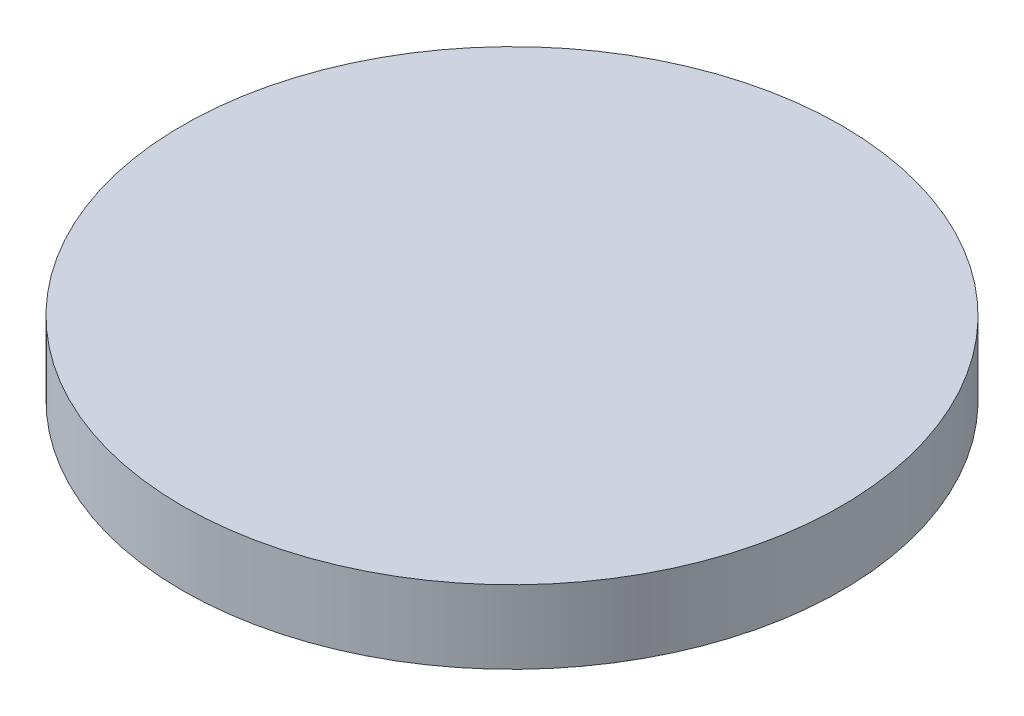
ISO-10303-21;
HEADER;
FILE_DESCRIPTION(('STEP AP214'),'2;1');
FILE_NAME('part.step','',(''),(''),'','','');
FILE_SCHEMA(('AUTOMOTIVE_DESIGN { 1 0 10303 214 1 1 1 1 }'));
ENDSEC;
DATA;
#1=APPLICATION_CONTEXT('core data for automotive mechanical design processes');
#2=APPLICATION_PROTOCOL_DEFINITION('international standard','automotive_design',2000,#1);
#3=PRODUCT_CONTEXT('',#1,'mechanical');
#4=PRODUCT('Part','Part','',(#3));
#5=PRODUCT_RELATED_PRODUCT_CATEGORY('part','',(#4));
#6=PRODUCT_DEFINITION_FORMATION('','',#4);
#7=PRODUCT_DEFINITION_CONTEXT('part definition',#1,'design');
#8=PRODUCT_DEFINITION('design','',#6,#7);
#9=PRODUCT_DEFINITION_SHAPE('','',#8);
#10=(LENGTH_UNIT() NAMED_UNIT(*) SI_UNIT(.MILLI.,.METRE.));
#11=(NAMED_UNIT(*) PLANE_ANGLE_UNIT() SI_UNIT($,.RADIAN.));
#12=(NAMED_UNIT(*) SI_UNIT($,.STERADIAN.) SOLID_ANGLE_UNIT());
#13=UNCERTAINTY_MEASURE_WITH_UNIT(LENGTH_MEASURE(1.E-05),#10,'distance_accuracy_value','');
#14=(GEOMETRIC_REPRESENTATION_CONTEXT(3) GLOBAL_UNCERTAINTY_ASSIGNED_CONTEXT((#13)) GLOBAL_UNIT_ASSIGNED_CONTEXT((#10,
#11,#12)) REPRESENTATION_CONTEXT('',''));
#15=CARTESIAN_POINT('',(0.,0.,0.));
#16=DIRECTION('',(0.,0.,1.));
#17=DIRECTION('',(1.,0.,0.));
#18=AXIS2_PLACEMENT_3D('',#15,#16,#17);
#19=CARTESIAN_POINT('',(0.,4.23333333333333,0.));
#20=DIRECTION('',(0.,-1.,0.));
#21=DIRECTION('',(0.,0.,-1.));
#22=AXIS2_PLACEMENT_3D('',#19,#20,#21);
#23=CYLINDRICAL_SURFACE('',#22,19.05);
#24=CARTESIAN_POINT('',(0.,4.23333333333333,0.));
#25=DIRECTION('',(0.,1.,0.));
#26=DIRECTION('',(0.,0.,1.));
#27=AXIS2_PLACEMENT_3D('',#24,#25,#26);
#28=CIRCLE('',#27,19.05);
#29=CARTESIAN_POINT('',(0.,4.23333333333333,19.05));
#30=VERTEX_POINT('',#29);
#31=EDGE_CURVE('E37',#30,#30,#28,.T.);
#32=ORIENTED_EDGE('',*,*,#31,.F.);
#33=EDGE_LOOP('',(#32));
#34=FACE_BOUND('',#33,.T.);
#35=CARTESIAN_POINT('',(0.,0.,0.));
#36=DIRECTION('',(0.,1.,0.));
#37=DIRECTION('',(0.,0.,1.));
#38=AXIS2_PLACEMENT_3D('',#35,#36,#37);
#39=CIRCLE('',#38,19.05);
#40=CARTESIAN_POINT('',(0.,0.,19.05));
#41=VERTEX_POINT('',#40);
#42=EDGE_CURVE('E41',#41,#41,#39,.T.);
#43=ORIENTED_EDGE('',*,*,#42,.T.);
#44=EDGE_LOOP('',(#43));
#45=FACE_BOUND('',#44,.T.);
#46=ADVANCED_FACE('F31',(#34,#45),#23,.T.);
#47=CARTESIAN_POINT('',(0.,4.23333333333333,0.));
#48=DIRECTION('',(0.,1.,0.));
#49=DIRECTION('',(0.,0.,1.));
#50=AXIS2_PLACEMENT_3D('',#47,#48,#49);
#51=PLANE('',#50);
#52=ORIENTED_EDGE('',*,*,#31,.T.);
#53=EDGE_LOOP('',(#52));
#54=FACE_BOUND('',#53,.T.);
#55=ADVANCED_FACE('F62',(#54),#51,.T.);
#56=CARTESIAN_POINT('',(0.,0.,0.));
#57=DIRECTION('',(0.,1.,0.));
#58=DIRECTION('',(0.,0.,1.));
#59=AXIS2_PLACEMENT_3D('',#56,#57,#58);
#60=PLANE('',#59);
#61=CARTESIAN_POINT('',(0.,0.,9.525));
#62=DIRECTION('',(0.,1.,0.));
#63=DIRECTION('',(0.,0.,1.));
#64=AXIS2_PLACEMENT_3D('',#61,#62,#63);
#65=CIRCLE('',#64,0.635);
#66=CARTESIAN_POINT('',(0.,0.,10.16));
#67=VERTEX_POINT('',#66);
#68=EDGE_CURVE('E10',#67,#67,#65,.F.);
#69=ORIENTED_EDGE('',*,*,#68,.F.);
#70=EDGE_LOOP('',(#69));
#71=FACE_BOUND('',#70,.T.);
#72=ORIENTED_EDGE('',*,*,#42,.F.);
#73=EDGE_LOOP('',(#72));
#74=FACE_BOUND('',#73,.T.);
#75=ADVANCED_FACE('F55',(#71,#74),#60,.F.);
#76=CARTESIAN_POINT('',(0.,-1.27,9.525));
#77=DIRECTION('',(0.,1.,0.));
#78=DIRECTION('',(0.,0.,1.));
#79=AXIS2_PLACEMENT_3D('',#76,#77,#78);
#80=CYLINDRICAL_SURFACE('',#79,0.635);
#81=CARTESIAN_POINT('',(0.,-1.27,9.525));
#82=DIRECTION('',(0.,-1.,0.));
#83=DIRECTION('',(0.,0.,-1.));
#84=AXIS2_PLACEMENT_3D('',#81,#82,#83);
#85=CIRCLE('',#84,0.635);
#86=CARTESIAN_POINT('',(0.,-1.27,8.89));
#87=VERTEX_POINT('',#86);
#88=EDGE_CURVE('E46',#87,#87,#85,.T.);
#89=ORIENTED_EDGE('',*,*,#88,.F.);
#90=EDGE_LOOP('',(#89));
#91=FACE_BOUND('',#90,.T.);
#92=ORIENTED_EDGE('',*,*,#68,.T.);
#93=EDGE_LOOP('',(#92));
#94=FACE_BOUND('',#93,.T.);
#95=ADVANCED_FACE('F53',(#91,#94),#80,.T.);
#96=CARTESIAN_POINT('',(0.,-1.27,9.525));
#97=DIRECTION('',(0.,-1.,0.));
#98=DIRECTION('',(0.,0.,-1.));
#99=AXIS2_PLACEMENT_3D('',#96,#97,#98);
#100=PLANE('',#99);
#101=ORIENTED_EDGE('',*,*,#88,.T.);
#102=EDGE_LOOP('',(#101));
#103=FACE_BOUND('',#102,.T.);
#104=ADVANCED_FACE('F51',(#103),#100,.T.);
#105=CLOSED_SHELL('',(#46,#55,#75,#95,#104));
#106=MANIFOLD_SOLID_BREP('B2',#105);
#107=ADVANCED_BREP_SHAPE_REPRESENTATION('',(#18,#106),#14);
#108=SHAPE_DEFINITION_REPRESENTATION(#9,#107);
ENDSEC;
END-ISO-10303-21;
